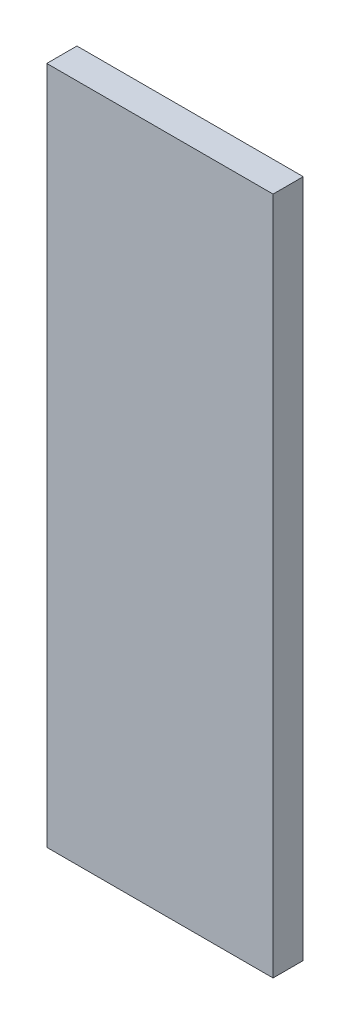
ISO-10303-21;
HEADER;
FILE_DESCRIPTION(('STEP AP214'),'2;1');
FILE_NAME('part.step','',(''),(''),'','','');
FILE_SCHEMA(('AUTOMOTIVE_DESIGN { 1 0 10303 214 1 1 1 1 }'));
ENDSEC;
DATA;
#1=APPLICATION_CONTEXT('core data for automotive mechanical design processes');
#2=APPLICATION_PROTOCOL_DEFINITION('international standard','automotive_design',2000,#1);
#3=PRODUCT_CONTEXT('',#1,'mechanical');
#4=PRODUCT('Part','Part','',(#3));
#5=PRODUCT_RELATED_PRODUCT_CATEGORY('part','',(#4));
#6=PRODUCT_DEFINITION_FORMATION('','',#4);
#7=PRODUCT_DEFINITION_CONTEXT('part definition',#1,'design');
#8=PRODUCT_DEFINITION('design','',#6,#7);
#9=PRODUCT_DEFINITION_SHAPE('','',#8);
#10=(LENGTH_UNIT() NAMED_UNIT(*) SI_UNIT(.MILLI.,.METRE.));
#11=(NAMED_UNIT(*) PLANE_ANGLE_UNIT() SI_UNIT($,.RADIAN.));
#12=(NAMED_UNIT(*) SI_UNIT($,.STERADIAN.) SOLID_ANGLE_UNIT());
#13=UNCERTAINTY_MEASURE_WITH_UNIT(LENGTH_MEASURE(1.E-05),#10,'distance_accuracy_value','');
#14=(GEOMETRIC_REPRESENTATION_CONTEXT(3) GLOBAL_UNCERTAINTY_ASSIGNED_CONTEXT((#13)) GLOBAL_UNIT_ASSIGNED_CONTEXT((#10,
#11,#12)) REPRESENTATION_CONTEXT('',''));
#15=CARTESIAN_POINT('',(0.,0.,0.));
#16=DIRECTION('',(0.,0.,1.));
#17=DIRECTION('',(1.,0.,0.));
#18=AXIS2_PLACEMENT_3D('',#15,#16,#17);
#19=CARTESIAN_POINT('',(0.,0.,2.));
#20=DIRECTION('',(1.,0.,0.));
#21=DIRECTION('',(0.,0.,-1.));
#22=AXIS2_PLACEMENT_3D('',#19,#20,#21);
#23=PLANE('',#22);
#24=DIRECTION('',(0.,-1.,0.));
#25=VECTOR('',#24,1.);
#26=CARTESIAN_POINT('',(0.,0.,0.));
#27=LINE('',#26,#25);
#28=CARTESIAN_POINT('',(0.,45.,0.));
#29=VERTEX_POINT('',#28);
#30=CARTESIAN_POINT('',(0.,0.,0.));
#31=VERTEX_POINT('',#30);
#32=EDGE_CURVE('E107',#29,#31,#27,.T.);
#33=ORIENTED_EDGE('',*,*,#32,.T.);
#34=DIRECTION('',(0.,0.,-1.));
#35=VECTOR('',#34,1.);
#36=CARTESIAN_POINT('',(0.,0.,2.));
#37=LINE('',#36,#35);
#38=CARTESIAN_POINT('',(0.,0.,2.));
#39=VERTEX_POINT('',#38);
#40=EDGE_CURVE('E11',#39,#31,#37,.T.);
#41=ORIENTED_EDGE('',*,*,#40,.F.);
#42=DIRECTION('',(0.,-1.,0.));
#43=VECTOR('',#42,1.);
#44=CARTESIAN_POINT('',(0.,0.,2.));
#45=LINE('',#44,#43);
#46=CARTESIAN_POINT('',(0.,45.,2.));
#47=VERTEX_POINT('',#46);
#48=EDGE_CURVE('E91',#47,#39,#45,.T.);
#49=ORIENTED_EDGE('',*,*,#48,.F.);
#50=DIRECTION('',(0.,0.,-1.));
#51=VECTOR('',#50,1.);
#52=CARTESIAN_POINT('',(0.,45.,2.));
#53=LINE('',#52,#51);
#54=EDGE_CURVE('E103',#47,#29,#53,.T.);
#55=ORIENTED_EDGE('',*,*,#54,.T.);
#56=EDGE_LOOP('',(#33,#41,#49,#55));
#57=FACE_BOUND('',#56,.T.);
#58=ADVANCED_FACE('F39',(#57),#23,.F.);
#59=CARTESIAN_POINT('',(0.,0.,2.));
#60=DIRECTION('',(0.,1.,0.));
#61=DIRECTION('',(0.,0.,1.));
#62=AXIS2_PLACEMENT_3D('',#59,#60,#61);
#63=PLANE('',#62);
#64=DIRECTION('',(1.,0.,0.));
#65=VECTOR('',#64,1.);
#66=CARTESIAN_POINT('',(0.,0.,0.));
#67=LINE('',#66,#65);
#68=CARTESIAN_POINT('',(15.,0.,0.));
#69=VERTEX_POINT('',#68);
#70=EDGE_CURVE('E96',#31,#69,#67,.T.);
#71=ORIENTED_EDGE('',*,*,#70,.T.);
#72=DIRECTION('',(0.,0.,-1.));
#73=VECTOR('',#72,1.);
#74=CARTESIAN_POINT('',(15.,0.,2.));
#75=LINE('',#74,#73);
#76=CARTESIAN_POINT('',(15.,0.,2.));
#77=VERTEX_POINT('',#76);
#78=EDGE_CURVE('E48',#77,#69,#75,.T.);
#79=ORIENTED_EDGE('',*,*,#78,.F.);
#80=DIRECTION('',(1.,0.,0.));
#81=VECTOR('',#80,1.);
#82=CARTESIAN_POINT('',(0.,0.,2.));
#83=LINE('',#82,#81);
#84=EDGE_CURVE('E86',#39,#77,#83,.T.);
#85=ORIENTED_EDGE('',*,*,#84,.F.);
#86=ORIENTED_EDGE('',*,*,#40,.T.);
#87=EDGE_LOOP('',(#71,#79,#85,#86));
#88=FACE_BOUND('',#87,.T.);
#89=ADVANCED_FACE('F95',(#88),#63,.F.);
#90=CARTESIAN_POINT('',(15.,0.,2.));
#91=DIRECTION('',(-1.,0.,0.));
#92=DIRECTION('',(0.,0.,1.));
#93=AXIS2_PLACEMENT_3D('',#90,#91,#92);
#94=PLANE('',#93);
#95=DIRECTION('',(0.,1.,0.));
#96=VECTOR('',#95,1.);
#97=CARTESIAN_POINT('',(15.,0.,0.));
#98=LINE('',#97,#96);
#99=CARTESIAN_POINT('',(15.,45.,0.));
#100=VERTEX_POINT('',#99);
#101=EDGE_CURVE('E73',#69,#100,#98,.T.);
#102=ORIENTED_EDGE('',*,*,#101,.T.);
#103=DIRECTION('',(0.,0.,-1.));
#104=VECTOR('',#103,1.);
#105=CARTESIAN_POINT('',(15.,45.,2.));
#106=LINE('',#105,#104);
#107=CARTESIAN_POINT('',(15.,45.,2.));
#108=VERTEX_POINT('',#107);
#109=EDGE_CURVE('E98',#108,#100,#106,.T.);
#110=ORIENTED_EDGE('',*,*,#109,.F.);
#111=DIRECTION('',(0.,1.,0.));
#112=VECTOR('',#111,1.);
#113=CARTESIAN_POINT('',(15.,0.,2.));
#114=LINE('',#113,#112);
#115=EDGE_CURVE('E89',#77,#108,#114,.T.);
#116=ORIENTED_EDGE('',*,*,#115,.F.);
#117=ORIENTED_EDGE('',*,*,#78,.T.);
#118=EDGE_LOOP('',(#102,#110,#116,#117));
#119=FACE_BOUND('',#118,.T.);
#120=ADVANCED_FACE('F99',(#119),#94,.F.);
#121=CARTESIAN_POINT('',(0.,45.,2.));
#122=DIRECTION('',(0.,-1.,0.));
#123=DIRECTION('',(0.,0.,-1.));
#124=AXIS2_PLACEMENT_3D('',#121,#122,#123);
#125=PLANE('',#124);
#126=DIRECTION('',(-1.,0.,0.));
#127=VECTOR('',#126,1.);
#128=CARTESIAN_POINT('',(0.,45.,0.));
#129=LINE('',#128,#127);
#130=EDGE_CURVE('E79',#100,#29,#129,.T.);
#131=ORIENTED_EDGE('',*,*,#130,.T.);
#132=ORIENTED_EDGE('',*,*,#54,.F.);
#133=DIRECTION('',(-1.,0.,0.));
#134=VECTOR('',#133,1.);
#135=CARTESIAN_POINT('',(0.,45.,2.));
#136=LINE('',#135,#134);
#137=EDGE_CURVE('E56',#108,#47,#136,.T.);
#138=ORIENTED_EDGE('',*,*,#137,.F.);
#139=ORIENTED_EDGE('',*,*,#109,.T.);
#140=EDGE_LOOP('',(#131,#132,#138,#139));
#141=FACE_BOUND('',#140,.T.);
#142=ADVANCED_FACE('F120',(#141),#125,.F.);
#143=CARTESIAN_POINT('',(0.,0.,2.));
#144=DIRECTION('',(0.,0.,-1.));
#145=DIRECTION('',(-1.,0.,0.));
#146=AXIS2_PLACEMENT_3D('',#143,#144,#145);
#147=PLANE('',#146);
#148=ORIENTED_EDGE('',*,*,#48,.T.);
#149=ORIENTED_EDGE('',*,*,#84,.T.);
#150=ORIENTED_EDGE('',*,*,#115,.T.);
#151=ORIENTED_EDGE('',*,*,#137,.T.);
#152=EDGE_LOOP('',(#148,#149,#150,#151));
#153=FACE_BOUND('',#152,.T.);
#154=ADVANCED_FACE('F87',(#153),#147,.F.);
#155=CARTESIAN_POINT('',(0.,0.,0.));
#156=DIRECTION('',(0.,0.,-1.));
#157=DIRECTION('',(-1.,0.,0.));
#158=AXIS2_PLACEMENT_3D('',#155,#156,#157);
#159=PLANE('',#158);
#160=ORIENTED_EDGE('',*,*,#32,.F.);
#161=ORIENTED_EDGE('',*,*,#130,.F.);
#162=ORIENTED_EDGE('',*,*,#101,.F.);
#163=ORIENTED_EDGE('',*,*,#70,.F.);
#164=EDGE_LOOP('',(#160,#161,#162,#163));
#165=FACE_BOUND('',#164,.T.);
#166=ADVANCED_FACE('F123',(#165),#159,.T.);
#167=CLOSED_SHELL('',(#58,#89,#120,#142,#154,#166));
#168=MANIFOLD_SOLID_BREP('B2',#167);
#169=ADVANCED_BREP_SHAPE_REPRESENTATION('',(#18,#168),#14);
#170=SHAPE_DEFINITION_REPRESENTATION(#9,#169);
ENDSEC;
END-ISO-10303-21;
